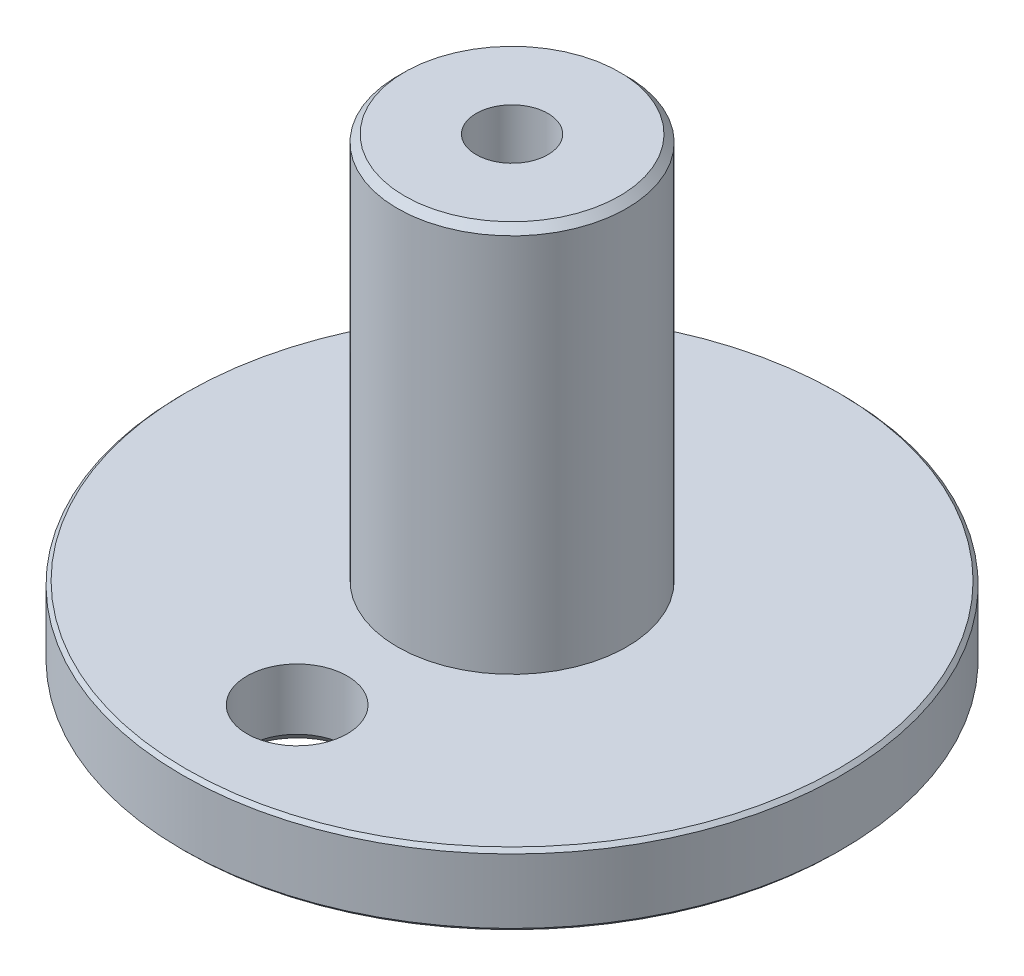
ISO-10303-21;
HEADER;
FILE_DESCRIPTION(('STEP AP214'),'2;1');
FILE_NAME('part.step','',(''),(''),'','','');
FILE_SCHEMA(('AUTOMOTIVE_DESIGN { 1 0 10303 214 1 1 1 1 }'));
ENDSEC;
DATA;
#1=APPLICATION_CONTEXT('core data for automotive mechanical design processes');
#2=APPLICATION_PROTOCOL_DEFINITION('international standard','automotive_design',2000,#1);
#3=PRODUCT_CONTEXT('',#1,'mechanical');
#4=PRODUCT('Part','Part','',(#3));
#5=PRODUCT_RELATED_PRODUCT_CATEGORY('part','',(#4));
#6=PRODUCT_DEFINITION_FORMATION('','',#4);
#7=PRODUCT_DEFINITION_CONTEXT('part definition',#1,'design');
#8=PRODUCT_DEFINITION('design','',#6,#7);
#9=PRODUCT_DEFINITION_SHAPE('','',#8);
#10=(LENGTH_UNIT() NAMED_UNIT(*) SI_UNIT(.MILLI.,.METRE.));
#11=(NAMED_UNIT(*) PLANE_ANGLE_UNIT() SI_UNIT($,.RADIAN.));
#12=(NAMED_UNIT(*) SI_UNIT($,.STERADIAN.) SOLID_ANGLE_UNIT());
#13=UNCERTAINTY_MEASURE_WITH_UNIT(LENGTH_MEASURE(1.E-05),#10,'distance_accuracy_value','');
#14=(GEOMETRIC_REPRESENTATION_CONTEXT(3) GLOBAL_UNCERTAINTY_ASSIGNED_CONTEXT((#13)) GLOBAL_UNIT_ASSIGNED_CONTEXT((#10,
#11,#12)) REPRESENTATION_CONTEXT('',''));
#15=CARTESIAN_POINT('',(0.,0.,0.));
#16=DIRECTION('',(0.,0.,1.));
#17=DIRECTION('',(1.,0.,0.));
#18=AXIS2_PLACEMENT_3D('',#15,#16,#17);
#19=CARTESIAN_POINT('',(0.,32.,0.));
#20=DIRECTION('',(0.,-1.,0.));
#21=DIRECTION('',(0.,0.,-1.));
#22=AXIS2_PLACEMENT_3D('',#19,#20,#21);
#23=CYLINDRICAL_SURFACE('',#22,23.);
#24=CARTESIAN_POINT('',(0.,0.25,0.));
#25=DIRECTION('',(0.,1.,0.));
#26=DIRECTION('',(0.,0.,1.));
#27=AXIS2_PLACEMENT_3D('',#24,#25,#26);
#28=CIRCLE('',#27,23.);
#29=CARTESIAN_POINT('',(0.,0.25,23.));
#30=VERTEX_POINT('',#29);
#31=EDGE_CURVE('E71',#30,#30,#28,.T.);
#32=ORIENTED_EDGE('',*,*,#31,.T.);
#33=EDGE_LOOP('',(#32));
#34=FACE_BOUND('',#33,.T.);
#35=CARTESIAN_POINT('',(0.,4.74999999999999,0.));
#36=DIRECTION('',(0.,1.,0.));
#37=DIRECTION('',(0.,0.,1.));
#38=AXIS2_PLACEMENT_3D('',#35,#36,#37);
#39=CIRCLE('',#38,23.);
#40=CARTESIAN_POINT('',(0.,4.74999999999999,23.));
#41=VERTEX_POINT('',#40);
#42=EDGE_CURVE('E75',#41,#41,#39,.F.);
#43=ORIENTED_EDGE('',*,*,#42,.T.);
#44=EDGE_LOOP('',(#43));
#45=FACE_BOUND('',#44,.T.);
#46=ADVANCED_FACE('F41',(#34,#45),#23,.T.);
#47=CARTESIAN_POINT('',(0.,0.,0.));
#48=DIRECTION('',(0.,1.,0.));
#49=DIRECTION('',(0.,0.,1.));
#50=AXIS2_PLACEMENT_3D('',#47,#48,#49);
#51=PLANE('',#50);
#52=CARTESIAN_POINT('',(0.,0.,15.));
#53=DIRECTION('',(0.,1.,0.));
#54=DIRECTION('',(0.,0.,1.));
#55=AXIS2_PLACEMENT_3D('',#52,#53,#54);
#56=CIRCLE('',#55,4.25000000000001);
#57=CARTESIAN_POINT('',(0.,0.,19.25));
#58=VERTEX_POINT('',#57);
#59=EDGE_CURVE('E11',#58,#58,#56,.T.);
#60=ORIENTED_EDGE('',*,*,#59,.T.);
#61=EDGE_LOOP('',(#60));
#62=FACE_BOUND('',#61,.T.);
#63=CARTESIAN_POINT('',(0.,0.,0.));
#64=DIRECTION('',(0.,1.,0.));
#65=DIRECTION('',(0.,0.,1.));
#66=AXIS2_PLACEMENT_3D('',#63,#64,#65);
#67=CIRCLE('',#66,22.75);
#68=CARTESIAN_POINT('',(0.,0.,22.75));
#69=VERTEX_POINT('',#68);
#70=EDGE_CURVE('E60',#69,#69,#67,.F.);
#71=ORIENTED_EDGE('',*,*,#70,.T.);
#72=EDGE_LOOP('',(#71));
#73=FACE_BOUND('',#72,.T.);
#74=CARTESIAN_POINT('',(0.,0.,0.));
#75=DIRECTION('',(0.,1.,0.));
#76=DIRECTION('',(0.,0.,1.));
#77=AXIS2_PLACEMENT_3D('',#74,#75,#76);
#78=CIRCLE('',#77,2.5);
#79=CARTESIAN_POINT('',(0.,0.,2.5));
#80=VERTEX_POINT('',#79);
#81=EDGE_CURVE('E91',#80,#80,#78,.T.);
#82=ORIENTED_EDGE('',*,*,#81,.T.);
#83=EDGE_LOOP('',(#82));
#84=FACE_BOUND('',#83,.T.);
#85=ADVANCED_FACE('F99',(#62,#73,#84),#51,.F.);
#86=CARTESIAN_POINT('',(0.,5.,0.));
#87=DIRECTION('',(0.,1.,0.));
#88=DIRECTION('',(0.,0.,1.));
#89=AXIS2_PLACEMENT_3D('',#86,#87,#88);
#90=PLANE('',#89);
#91=CARTESIAN_POINT('',(0.,5.,15.));
#92=DIRECTION('',(0.,1.,0.));
#93=DIRECTION('',(0.,0.,1.));
#94=AXIS2_PLACEMENT_3D('',#91,#92,#93);
#95=CIRCLE('',#94,3.5);
#96=CARTESIAN_POINT('',(0.,5.,18.5));
#97=VERTEX_POINT('',#96);
#98=EDGE_CURVE('E63',#97,#97,#95,.T.);
#99=ORIENTED_EDGE('',*,*,#98,.F.);
#100=EDGE_LOOP('',(#99));
#101=FACE_BOUND('',#100,.T.);
#102=CARTESIAN_POINT('',(0.,5.,0.));
#103=DIRECTION('',(0.,1.,0.));
#104=DIRECTION('',(0.,0.,1.));
#105=AXIS2_PLACEMENT_3D('',#102,#103,#104);
#106=CIRCLE('',#105,22.75);
#107=CARTESIAN_POINT('',(0.,5.,22.75));
#108=VERTEX_POINT('',#107);
#109=EDGE_CURVE('E55',#108,#108,#106,.T.);
#110=ORIENTED_EDGE('',*,*,#109,.T.);
#111=EDGE_LOOP('',(#110));
#112=FACE_BOUND('',#111,.T.);
#113=CARTESIAN_POINT('',(0.,5.,0.));
#114=DIRECTION('',(0.,1.,0.));
#115=DIRECTION('',(0.,0.,1.));
#116=AXIS2_PLACEMENT_3D('',#113,#114,#115);
#117=CIRCLE('',#116,8.);
#118=CARTESIAN_POINT('',(0.,5.,8.));
#119=VERTEX_POINT('',#118);
#120=EDGE_CURVE('E87',#119,#119,#117,.T.);
#121=ORIENTED_EDGE('',*,*,#120,.F.);
#122=EDGE_LOOP('',(#121));
#123=FACE_BOUND('',#122,.T.);
#124=ADVANCED_FACE('F116',(#101,#112,#123),#90,.T.);
#125=CARTESIAN_POINT('',(0.,5.,0.));
#126=DIRECTION('',(0.,1.,0.));
#127=DIRECTION('',(0.,0.,1.));
#128=AXIS2_PLACEMENT_3D('',#125,#126,#127);
#129=CYLINDRICAL_SURFACE('',#128,8.);
#130=CARTESIAN_POINT('',(0.,31.5,0.));
#131=DIRECTION('',(0.,1.,0.));
#132=DIRECTION('',(0.,0.,1.));
#133=AXIS2_PLACEMENT_3D('',#130,#131,#132);
#134=CIRCLE('',#133,8.);
#135=CARTESIAN_POINT('',(0.,31.5,8.));
#136=VERTEX_POINT('',#135);
#137=EDGE_CURVE('E79',#136,#136,#134,.F.);
#138=ORIENTED_EDGE('',*,*,#137,.T.);
#139=EDGE_LOOP('',(#138));
#140=FACE_BOUND('',#139,.T.);
#141=ORIENTED_EDGE('',*,*,#120,.T.);
#142=EDGE_LOOP('',(#141));
#143=FACE_BOUND('',#142,.T.);
#144=ADVANCED_FACE('F110',(#140,#143),#129,.T.);
#145=CARTESIAN_POINT('',(0.,32.,0.));
#146=DIRECTION('',(0.,1.,0.));
#147=DIRECTION('',(0.,0.,1.));
#148=AXIS2_PLACEMENT_3D('',#145,#146,#147);
#149=PLANE('',#148);
#150=CARTESIAN_POINT('',(0.,32.,0.));
#151=DIRECTION('',(0.,1.,0.));
#152=DIRECTION('',(0.,0.,1.));
#153=AXIS2_PLACEMENT_3D('',#150,#151,#152);
#154=CIRCLE('',#153,7.5);
#155=CARTESIAN_POINT('',(0.,32.,7.5));
#156=VERTEX_POINT('',#155);
#157=EDGE_CURVE('E83',#156,#156,#154,.T.);
#158=ORIENTED_EDGE('',*,*,#157,.T.);
#159=EDGE_LOOP('',(#158));
#160=FACE_BOUND('',#159,.T.);
#161=CARTESIAN_POINT('',(0.,32.,0.));
#162=DIRECTION('',(0.,1.,0.));
#163=DIRECTION('',(0.,0.,1.));
#164=AXIS2_PLACEMENT_3D('',#161,#162,#163);
#165=CIRCLE('',#164,2.5);
#166=CARTESIAN_POINT('',(0.,32.,2.5));
#167=VERTEX_POINT('',#166);
#168=EDGE_CURVE('E66',#167,#167,#165,.T.);
#169=ORIENTED_EDGE('',*,*,#168,.F.);
#170=EDGE_LOOP('',(#169));
#171=FACE_BOUND('',#170,.T.);
#172=ADVANCED_FACE('F105',(#160,#171),#149,.T.);
#173=CARTESIAN_POINT('',(0.,0.,0.));
#174=DIRECTION('',(0.,1.,0.));
#175=DIRECTION('',(0.,0.,1.));
#176=AXIS2_PLACEMENT_3D('',#173,#174,#175);
#177=CYLINDRICAL_SURFACE('',#176,2.5);
#178=ORIENTED_EDGE('',*,*,#81,.F.);
#179=EDGE_LOOP('',(#178));
#180=FACE_BOUND('',#179,.T.);
#181=ORIENTED_EDGE('',*,*,#168,.T.);
#182=EDGE_LOOP('',(#181));
#183=FACE_BOUND('',#182,.T.);
#184=ADVANCED_FACE('F101',(#180,#183),#177,.F.);
#185=CARTESIAN_POINT('',(0.,32.,0.));
#186=DIRECTION('',(0.,-1.,0.));
#187=DIRECTION('',(0.,0.,-1.));
#188=AXIS2_PLACEMENT_3D('',#185,#186,#187);
#189=CONICAL_SURFACE('',#188,7.5,0.785398163397448);
#190=ORIENTED_EDGE('',*,*,#137,.F.);
#191=EDGE_LOOP('',(#190));
#192=FACE_BOUND('',#191,.T.);
#193=ORIENTED_EDGE('',*,*,#157,.F.);
#194=EDGE_LOOP('',(#193));
#195=FACE_BOUND('',#194,.T.);
#196=ADVANCED_FACE('F104',(#192,#195),#189,.T.);
#197=CARTESIAN_POINT('',(0.,0.25,0.));
#198=DIRECTION('',(0.,1.,0.));
#199=DIRECTION('',(0.,0.,1.));
#200=AXIS2_PLACEMENT_3D('',#197,#198,#199);
#201=CONICAL_SURFACE('',#200,23.,0.785398163397441);
#202=ORIENTED_EDGE('',*,*,#70,.F.);
#203=EDGE_LOOP('',(#202));
#204=FACE_BOUND('',#203,.T.);
#205=ORIENTED_EDGE('',*,*,#31,.F.);
#206=EDGE_LOOP('',(#205));
#207=FACE_BOUND('',#206,.T.);
#208=ADVANCED_FACE('F136',(#204,#207),#201,.T.);
#209=CARTESIAN_POINT('',(0.,5.,0.));
#210=DIRECTION('',(0.,-1.,0.));
#211=DIRECTION('',(0.,0.,-1.));
#212=AXIS2_PLACEMENT_3D('',#209,#210,#211);
#213=CONICAL_SURFACE('',#212,22.75,0.785398163397435);
#214=ORIENTED_EDGE('',*,*,#42,.F.);
#215=EDGE_LOOP('',(#214));
#216=FACE_BOUND('',#215,.T.);
#217=ORIENTED_EDGE('',*,*,#109,.F.);
#218=EDGE_LOOP('',(#217));
#219=FACE_BOUND('',#218,.T.);
#220=ADVANCED_FACE('F142',(#216,#219),#213,.T.);
#221=CARTESIAN_POINT('',(0.,32.,15.));
#222=DIRECTION('',(0.,-1.,0.));
#223=DIRECTION('',(0.,0.,-1.));
#224=AXIS2_PLACEMENT_3D('',#221,#222,#223);
#225=CYLINDRICAL_SURFACE('',#224,3.5);
#226=CARTESIAN_POINT('',(0.,0.750000000000011,15.));
#227=DIRECTION('',(0.,1.,0.));
#228=DIRECTION('',(0.,0.,1.));
#229=AXIS2_PLACEMENT_3D('',#226,#227,#228);
#230=CIRCLE('',#229,3.5);
#231=CARTESIAN_POINT('',(0.,0.750000000000011,18.5));
#232=VERTEX_POINT('',#231);
#233=EDGE_CURVE('E50',#232,#232,#230,.F.);
#234=ORIENTED_EDGE('',*,*,#233,.T.);
#235=EDGE_LOOP('',(#234));
#236=FACE_BOUND('',#235,.T.);
#237=ORIENTED_EDGE('',*,*,#98,.T.);
#238=EDGE_LOOP('',(#237));
#239=FACE_BOUND('',#238,.T.);
#240=ADVANCED_FACE('F147',(#236,#239),#225,.F.);
#241=CARTESIAN_POINT('',(0.,0.750000000000011,15.));
#242=DIRECTION('',(0.,-1.,0.));
#243=DIRECTION('',(0.,0.,-1.));
#244=AXIS2_PLACEMENT_3D('',#241,#242,#243);
#245=CONICAL_SURFACE('',#244,3.5,0.785398163397448);
#246=ORIENTED_EDGE('',*,*,#59,.F.);
#247=EDGE_LOOP('',(#246));
#248=FACE_BOUND('',#247,.T.);
#249=ORIENTED_EDGE('',*,*,#233,.F.);
#250=EDGE_LOOP('',(#249));
#251=FACE_BOUND('',#250,.T.);
#252=ADVANCED_FACE('F44',(#248,#251),#245,.F.);
#253=CLOSED_SHELL('',(#46,#85,#124,#144,#172,#184,#196,#208,#220,#240,#252));
#254=MANIFOLD_SOLID_BREP('B2',#253);
#255=ADVANCED_BREP_SHAPE_REPRESENTATION('',(#18,#254),#14);
#256=SHAPE_DEFINITION_REPRESENTATION(#9,#255);
ENDSEC;
END-ISO-10303-21;
